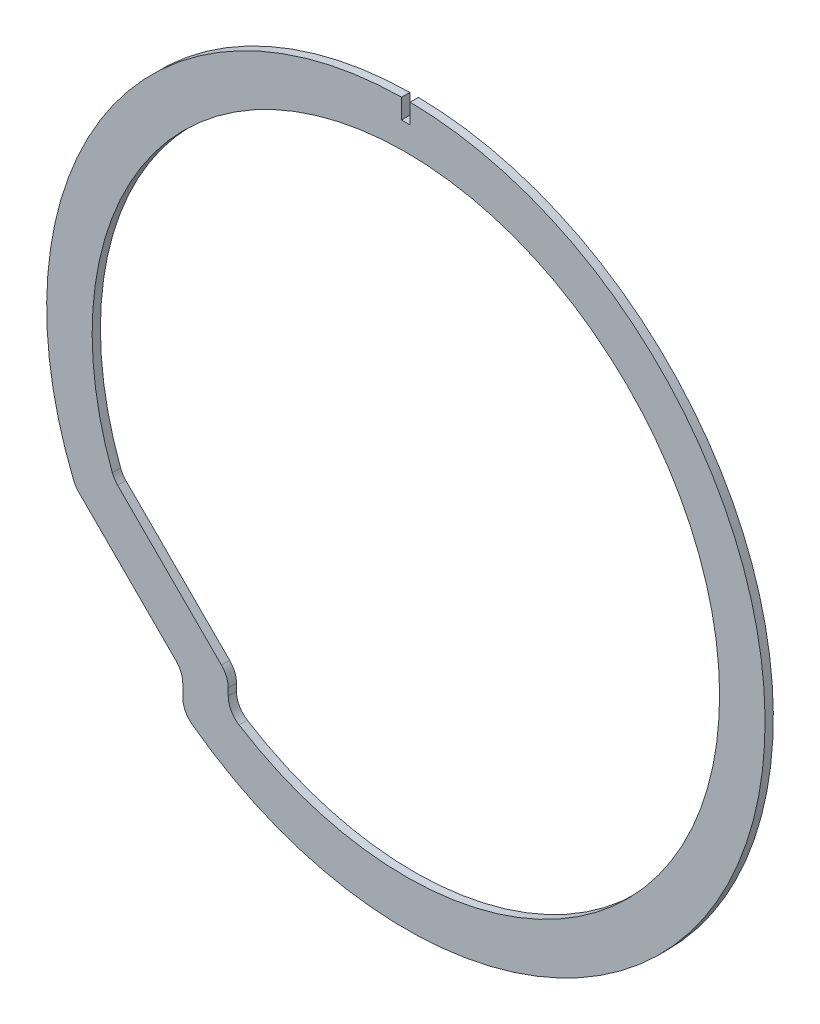
ISO-10303-21;
HEADER;
FILE_DESCRIPTION(('STEP AP214'),'2;1');
FILE_NAME('part.step','',(''),(''),'','','');
FILE_SCHEMA(('AUTOMOTIVE_DESIGN { 1 0 10303 214 1 1 1 1 }'));
ENDSEC;
DATA;
#1=APPLICATION_CONTEXT('core data for automotive mechanical design processes');
#2=APPLICATION_PROTOCOL_DEFINITION('international standard','automotive_design',2000,#1);
#3=PRODUCT_CONTEXT('',#1,'mechanical');
#4=PRODUCT('Part','Part','',(#3));
#5=PRODUCT_RELATED_PRODUCT_CATEGORY('part','',(#4));
#6=PRODUCT_DEFINITION_FORMATION('','',#4);
#7=PRODUCT_DEFINITION_CONTEXT('part definition',#1,'design');
#8=PRODUCT_DEFINITION('design','',#6,#7);
#9=PRODUCT_DEFINITION_SHAPE('','',#8);
#10=(LENGTH_UNIT() NAMED_UNIT(*) SI_UNIT(.MILLI.,.METRE.));
#11=(NAMED_UNIT(*) PLANE_ANGLE_UNIT() SI_UNIT($,.RADIAN.));
#12=(NAMED_UNIT(*) SI_UNIT($,.STERADIAN.) SOLID_ANGLE_UNIT());
#13=UNCERTAINTY_MEASURE_WITH_UNIT(LENGTH_MEASURE(1.E-05),#10,'distance_accuracy_value','');
#14=(GEOMETRIC_REPRESENTATION_CONTEXT(3) GLOBAL_UNCERTAINTY_ASSIGNED_CONTEXT((#13)) GLOBAL_UNIT_ASSIGNED_CONTEXT((#10,
#11,#12)) REPRESENTATION_CONTEXT('',''));
#15=CARTESIAN_POINT('',(0.,0.,0.));
#16=DIRECTION('',(0.,0.,1.));
#17=DIRECTION('',(1.,0.,0.));
#18=AXIS2_PLACEMENT_3D('',#15,#16,#17);
#19=CARTESIAN_POINT('',(0.,21.844,1.5875));
#20=DIRECTION('',(0.,0.,-1.));
#21=DIRECTION('',(-1.,0.,0.));
#22=AXIS2_PLACEMENT_3D('',#19,#20,#21);
#23=CYLINDRICAL_SURFACE('',#22,138.43);
#24=DIRECTION('',(0.,0.,1.));
#25=VECTOR('',#24,1.);
#26=CARTESIAN_POINT('',(-1.65404660342628,160.264117865264,-1.58750000000002));
#27=LINE('',#26,#25);
#28=CARTESIAN_POINT('',(-1.65404660342628,160.264117865264,-1.58750000000002));
#29=VERTEX_POINT('',#28);
#30=CARTESIAN_POINT('',(-1.65404660342628,160.264117865264,1.5875));
#31=VERTEX_POINT('',#30);
#32=EDGE_CURVE('E270',#29,#31,#27,.T.);
#33=ORIENTED_EDGE('',*,*,#32,.F.);
#34=CARTESIAN_POINT('',(0.,21.844,-1.5875));
#35=DIRECTION('',(0.,0.,1.));
#36=DIRECTION('',(1.,0.,0.));
#37=AXIS2_PLACEMENT_3D('',#34,#35,#36);
#38=CIRCLE('',#37,138.43);
#39=CARTESIAN_POINT('',(-127.991910594261,-30.8905780530259,-1.5875));
#40=VERTEX_POINT('',#39);
#41=EDGE_CURVE('E193',#29,#40,#38,.T.);
#42=ORIENTED_EDGE('',*,*,#41,.T.);
#43=DIRECTION('',(0.,0.,-1.));
#44=VECTOR('',#43,1.);
#45=CARTESIAN_POINT('',(-127.991910594261,-30.8905780530259,1.5875));
#46=LINE('',#45,#44);
#47=CARTESIAN_POINT('',(-127.991910594261,-30.8905780530259,1.5875));
#48=VERTEX_POINT('',#47);
#49=EDGE_CURVE('E218',#40,#48,#46,.F.);
#50=ORIENTED_EDGE('',*,*,#49,.T.);
#51=CARTESIAN_POINT('',(0.,21.844,1.5875));
#52=DIRECTION('',(0.,0.,1.));
#53=DIRECTION('',(1.,0.,0.));
#54=AXIS2_PLACEMENT_3D('',#51,#52,#53);
#55=CIRCLE('',#54,138.43);
#56=EDGE_CURVE('E197',#31,#48,#55,.T.);
#57=ORIENTED_EDGE('',*,*,#56,.F.);
#58=EDGE_LOOP('',(#33,#42,#50,#57));
#59=FACE_BOUND('',#58,.T.);
#60=ADVANCED_FACE('F37',(#59),#23,.T.);
#61=CARTESIAN_POINT('',(0.,21.844,1.5875));
#62=DIRECTION('',(0.,0.,1.));
#63=DIRECTION('',(1.,0.,0.));
#64=AXIS2_PLACEMENT_3D('',#61,#62,#63);
#65=PLANE('',#64);
#66=DIRECTION('',(0.,-1.,0.));
#67=VECTOR('',#66,1.);
#68=CARTESIAN_POINT('',(-68.4581307618716,-66.6049212990085,1.5875));
#69=LINE('',#68,#67);
#70=CARTESIAN_POINT('',(-68.4581307618716,-70.2872798685054,1.5875));
#71=VERTEX_POINT('',#70);
#72=CARTESIAN_POINT('',(-68.4581307618715,-73.0178679635636,1.5875));
#73=VERTEX_POINT('',#72);
#74=EDGE_CURVE('E266',#71,#73,#69,.T.);
#75=ORIENTED_EDGE('',*,*,#74,.F.);
#76=CARTESIAN_POINT('',(-77.3481307618716,-70.2872798685054,1.58750000000002));
#77=DIRECTION('',(0.,0.,1.));
#78=DIRECTION('',(1.,0.,0.));
#79=AXIS2_PLACEMENT_3D('',#76,#77,#78);
#80=CIRCLE('',#79,8.89);
#81=CARTESIAN_POINT('',(-71.0619514771232,-64.0011005837569,1.5875));
#82=VERTEX_POINT('',#81);
#83=EDGE_CURVE('E221',#71,#82,#80,.T.);
#84=ORIENTED_EDGE('',*,*,#83,.T.);
#85=DIRECTION('',(0.707106781186551,-0.707106781186544,0.));
#86=VECTOR('',#85,1.);
#87=CARTESIAN_POINT('',(-112.423113331304,-22.6399387295762,1.5875));
#88=LINE('',#87,#86);
#89=CARTESIAN_POINT('',(-111.094637556966,-23.9684145039149,1.5875));
#90=VERTEX_POINT('',#89);
#91=EDGE_CURVE('E262',#90,#82,#88,.T.);
#92=ORIENTED_EDGE('',*,*,#91,.F.);
#93=CARTESIAN_POINT('',(-104.808458272217,-17.6822352191664,1.58750000000002));
#94=DIRECTION('',(0.,0.,1.));
#95=DIRECTION('',(1.,0.,0.));
#96=AXIS2_PLACEMENT_3D('',#93,#94,#95);
#97=CIRCLE('',#96,8.89);
#98=CARTESIAN_POINT('',(-113.126589881123,-20.8192380143384,1.5875));
#99=VERTEX_POINT('',#98);
#100=EDGE_CURVE('E187',#90,#99,#97,.F.);
#101=ORIENTED_EDGE('',*,*,#100,.T.);
#102=CARTESIAN_POINT('',(0.,21.844,1.5875));
#103=DIRECTION('',(0.,0.,1.));
#104=DIRECTION('',(1.,0.,0.));
#105=AXIS2_PLACEMENT_3D('',#102,#103,#104);
#106=CIRCLE('',#105,120.904);
#107=CARTESIAN_POINT('',(-64.2957601874169,-80.5465876432115,1.5875));
#108=VERTEX_POINT('',#107);
#109=EDGE_CURVE('E243',#108,#99,#106,.T.);
#110=ORIENTED_EDGE('',*,*,#109,.F.);
#111=CARTESIAN_POINT('',(-59.5681307618716,-73.0178679635636,1.58750000000002));
#112=DIRECTION('',(0.,0.,1.));
#113=DIRECTION('',(1.,0.,0.));
#114=AXIS2_PLACEMENT_3D('',#111,#112,#113);
#115=CIRCLE('',#114,8.89);
#116=EDGE_CURVE('E47',#108,#73,#115,.F.);
#117=ORIENTED_EDGE('',*,*,#116,.T.);
#118=EDGE_LOOP('',(#75,#84,#92,#101,#110,#117));
#119=FACE_BOUND('',#118,.T.);
#120=DIRECTION('',(0.999999999678307,2.53650800309862E-05,0.));
#121=VECTOR('',#120,1.);
#122=CARTESIAN_POINT('',(-0.00387183132879656,152.644159719628,1.5875));
#123=LINE('',#122,#121);
#124=CARTESIAN_POINT('',(-1.65385332151647,152.644117867716,1.5875));
#125=VERTEX_POINT('',#124);
#126=CARTESIAN_POINT('',(1.64814667742129,152.64420162321,1.5875));
#127=VERTEX_POINT('',#126);
#128=EDGE_CURVE('E497',#125,#127,#123,.T.);
#129=ORIENTED_EDGE('',*,*,#128,.F.);
#130=DIRECTION('',(-2.53650800268556E-05,0.999999999678307,0.));
#131=VECTOR('',#130,1.);
#132=CARTESIAN_POINT('',(-1.64998149018831,-4.18519125549203E-05,1.5875));
#133=LINE('',#132,#131);
#134=EDGE_CURVE('E501',#125,#31,#133,.T.);
#135=ORIENTED_EDGE('',*,*,#134,.T.);
#136=ORIENTED_EDGE('',*,*,#56,.T.);
#137=CARTESIAN_POINT('',(-119.772246611143,-27.5039537743912,1.5875));
#138=DIRECTION('',(0.,0.,1.));
#139=DIRECTION('',(1.,0.,0.));
#140=AXIS2_PLACEMENT_3D('',#137,#138,#139);
#141=CIRCLE('',#140,8.89);
#142=CARTESIAN_POINT('',(-126.058425895892,-33.7901330591397,1.5875));
#143=VERTEX_POINT('',#142);
#144=EDGE_CURVE('E225',#48,#143,#141,.T.);
#145=ORIENTED_EDGE('',*,*,#144,.T.);
#146=DIRECTION('',(0.707106781186551,-0.707106781186544,0.));
#147=VECTOR('',#146,1.);
#148=CARTESIAN_POINT('',(-127.29330891879,-32.5552500362416,1.5875));
#149=LINE('',#148,#147);
#150=CARTESIAN_POINT('',(-88.5879514771231,-71.2606074779079,1.5875));
#151=VERTEX_POINT('',#150);
#152=EDGE_CURVE('E160',#143,#151,#149,.T.);
#153=ORIENTED_EDGE('',*,*,#152,.T.);
#154=CARTESIAN_POINT('',(-94.8741307618715,-77.5467867626563,1.5875));
#155=DIRECTION('',(0.,0.,1.));
#156=DIRECTION('',(1.,0.,0.));
#157=AXIS2_PLACEMENT_3D('',#154,#155,#156);
#158=CIRCLE('',#157,8.89);
#159=CARTESIAN_POINT('',(-85.9841307618715,-77.5467867626563,1.5875));
#160=VERTEX_POINT('',#159);
#161=EDGE_CURVE('E153',#151,#160,#158,.F.);
#162=ORIENTED_EDGE('',*,*,#161,.T.);
#163=DIRECTION('',(0.,-1.,0.));
#164=VECTOR('',#163,1.);
#165=CARTESIAN_POINT('',(-85.9841307618715,-73.8644281931595,1.5875));
#166=LINE('',#165,#164);
#167=CARTESIAN_POINT('',(-85.9841307618715,-82.2574245919404,1.5875));
#168=VERTEX_POINT('',#167);
#169=EDGE_CURVE('E157',#160,#168,#166,.T.);
#170=ORIENTED_EDGE('',*,*,#169,.T.);
#171=CARTESIAN_POINT('',(-77.0941307618715,-82.2574245919404,1.5875));
#172=DIRECTION('',(0.,0.,1.));
#173=DIRECTION('',(1.,0.,0.));
#174=AXIS2_PLACEMENT_3D('',#171,#172,#173);
#175=CIRCLE('',#174,8.89);
#176=CARTESIAN_POINT('',(-82.3849044416078,-89.4016400051128,1.5875));
#177=VERTEX_POINT('',#176);
#178=EDGE_CURVE('E223',#168,#177,#175,.T.);
#179=ORIENTED_EDGE('',*,*,#178,.T.);
#180=CARTESIAN_POINT('',(1.64795339579251,160.264190541717,1.5875));
#181=VERTEX_POINT('',#180);
#182=EDGE_CURVE('E274',#177,#181,#55,.T.);
#183=ORIENTED_EDGE('',*,*,#182,.T.);
#184=DIRECTION('',(-2.53650800271401E-05,0.999999999678307,0.));
#185=VECTOR('',#184,1.);
#186=CARTESIAN_POINT('',(1.6520185087495,4.1903581694228E-05,1.5875));
#187=LINE('',#186,#185);
#188=EDGE_CURVE('E500',#127,#181,#187,.T.);
#189=ORIENTED_EDGE('',*,*,#188,.F.);
#190=EDGE_LOOP('',(#129,#135,#136,#145,#153,#162,#170,#179,#183,#189));
#191=FACE_BOUND('',#190,.T.);
#192=ADVANCED_FACE('F156',(#119,#191),#65,.T.);
#193=CARTESIAN_POINT('',(0.,21.844,-1.5875));
#194=DIRECTION('',(0.,0.,1.));
#195=DIRECTION('',(1.,0.,0.));
#196=AXIS2_PLACEMENT_3D('',#193,#194,#195);
#197=PLANE('',#196);
#198=DIRECTION('',(-0.707106781186551,0.707106781186544,0.));
#199=VECTOR('',#198,1.);
#200=CARTESIAN_POINT('',(-112.423113331304,-22.6399387295762,-1.58750000000002));
#201=LINE('',#200,#199);
#202=CARTESIAN_POINT('',(-71.0619514771232,-64.0011005837569,-1.58750000000002));
#203=VERTEX_POINT('',#202);
#204=CARTESIAN_POINT('',(-111.094637556966,-23.9684145039149,-1.58750000000002));
#205=VERTEX_POINT('',#204);
#206=EDGE_CURVE('E253',#203,#205,#201,.T.);
#207=ORIENTED_EDGE('',*,*,#206,.F.);
#208=CARTESIAN_POINT('',(-77.3481307618716,-70.2872798685054,-1.58750000000002));
#209=DIRECTION('',(0.,0.,1.));
#210=DIRECTION('',(1.,0.,0.));
#211=AXIS2_PLACEMENT_3D('',#208,#209,#210);
#212=CIRCLE('',#211,8.89);
#213=CARTESIAN_POINT('',(-68.4581307618716,-70.2872798685054,-1.58750000000002));
#214=VERTEX_POINT('',#213);
#215=EDGE_CURVE('E208',#203,#214,#212,.F.);
#216=ORIENTED_EDGE('',*,*,#215,.T.);
#217=DIRECTION('',(0.,1.,0.));
#218=VECTOR('',#217,1.);
#219=CARTESIAN_POINT('',(-68.4581307618716,-66.6049212990085,-1.58750000000002));
#220=LINE('',#219,#218);
#221=CARTESIAN_POINT('',(-68.4581307618715,-73.0178679635636,-1.58750000000002));
#222=VERTEX_POINT('',#221);
#223=EDGE_CURVE('E254',#222,#214,#220,.T.);
#224=ORIENTED_EDGE('',*,*,#223,.F.);
#225=CARTESIAN_POINT('',(-59.5681307618716,-73.0178679635636,-1.58750000000002));
#226=DIRECTION('',(0.,0.,1.));
#227=DIRECTION('',(1.,0.,0.));
#228=AXIS2_PLACEMENT_3D('',#225,#226,#227);
#229=CIRCLE('',#228,8.89);
#230=CARTESIAN_POINT('',(-64.2957601874169,-80.5465876432115,-1.58750000000002));
#231=VERTEX_POINT('',#230);
#232=EDGE_CURVE('E11',#222,#231,#229,.T.);
#233=ORIENTED_EDGE('',*,*,#232,.T.);
#234=CARTESIAN_POINT('',(0.,21.844,-1.58750000000002));
#235=DIRECTION('',(0.,0.,1.));
#236=DIRECTION('',(1.,0.,0.));
#237=AXIS2_PLACEMENT_3D('',#234,#235,#236);
#238=CIRCLE('',#237,120.904);
#239=CARTESIAN_POINT('',(-113.126589881123,-20.8192380143384,-1.58750000000002));
#240=VERTEX_POINT('',#239);
#241=EDGE_CURVE('E240',#240,#231,#238,.F.);
#242=ORIENTED_EDGE('',*,*,#241,.F.);
#243=CARTESIAN_POINT('',(-104.808458272217,-17.6822352191664,-1.58750000000002));
#244=DIRECTION('',(0.,0.,1.));
#245=DIRECTION('',(1.,0.,0.));
#246=AXIS2_PLACEMENT_3D('',#243,#244,#245);
#247=CIRCLE('',#246,8.89);
#248=EDGE_CURVE('E189',#240,#205,#247,.T.);
#249=ORIENTED_EDGE('',*,*,#248,.T.);
#250=EDGE_LOOP('',(#207,#216,#224,#233,#242,#249));
#251=FACE_BOUND('',#250,.T.);
#252=DIRECTION('',(-2.53650800268556E-05,0.999999999678307,0.));
#253=VECTOR('',#252,1.);
#254=CARTESIAN_POINT('',(-1.64998149018831,-4.18519125549203E-05,-1.58750000000002));
#255=LINE('',#254,#253);
#256=CARTESIAN_POINT('',(-1.65385332151647,152.644117867716,-1.58750000000002));
#257=VERTEX_POINT('',#256);
#258=EDGE_CURVE('E503',#257,#29,#255,.T.);
#259=ORIENTED_EDGE('',*,*,#258,.F.);
#260=DIRECTION('',(0.999999999678307,2.53650800309862E-05,0.));
#261=VECTOR('',#260,1.);
#262=CARTESIAN_POINT('',(-0.00387183132879656,152.644159719628,-1.58750000000002));
#263=LINE('',#262,#261);
#264=CARTESIAN_POINT('',(1.64814667742129,152.64420162321,-1.5875));
#265=VERTEX_POINT('',#264);
#266=EDGE_CURVE('E504',#257,#265,#263,.T.);
#267=ORIENTED_EDGE('',*,*,#266,.T.);
#268=DIRECTION('',(-2.53650800271401E-05,0.999999999678307,0.));
#269=VECTOR('',#268,1.);
#270=CARTESIAN_POINT('',(1.6520185087495,4.1903581694228E-05,-1.58750000000002));
#271=LINE('',#270,#269);
#272=CARTESIAN_POINT('',(1.64795339579251,160.264190541717,-1.58750000000001));
#273=VERTEX_POINT('',#272);
#274=EDGE_CURVE('E56',#265,#273,#271,.T.);
#275=ORIENTED_EDGE('',*,*,#274,.T.);
#276=CARTESIAN_POINT('',(-82.3849044416078,-89.4016400051128,-1.5875));
#277=VERTEX_POINT('',#276);
#278=EDGE_CURVE('E195',#277,#273,#38,.T.);
#279=ORIENTED_EDGE('',*,*,#278,.F.);
#280=CARTESIAN_POINT('',(-77.0941307618715,-82.2574245919404,-1.5875));
#281=DIRECTION('',(0.,0.,1.));
#282=DIRECTION('',(1.,0.,0.));
#283=AXIS2_PLACEMENT_3D('',#280,#281,#282);
#284=CIRCLE('',#283,8.89);
#285=CARTESIAN_POINT('',(-85.9841307618715,-82.2574245919404,-1.5875));
#286=VERTEX_POINT('',#285);
#287=EDGE_CURVE('E210',#277,#286,#284,.F.);
#288=ORIENTED_EDGE('',*,*,#287,.T.);
#289=DIRECTION('',(0.,-1.,0.));
#290=VECTOR('',#289,1.);
#291=CARTESIAN_POINT('',(-85.9841307618715,-73.8644281931595,-1.5875));
#292=LINE('',#291,#290);
#293=CARTESIAN_POINT('',(-85.9841307618715,-77.5467867626563,-1.5875));
#294=VERTEX_POINT('',#293);
#295=EDGE_CURVE('E196',#294,#286,#292,.T.);
#296=ORIENTED_EDGE('',*,*,#295,.F.);
#297=CARTESIAN_POINT('',(-94.8741307618715,-77.5467867626563,-1.5875));
#298=DIRECTION('',(0.,0.,1.));
#299=DIRECTION('',(1.,0.,0.));
#300=AXIS2_PLACEMENT_3D('',#297,#298,#299);
#301=CIRCLE('',#300,8.89);
#302=CARTESIAN_POINT('',(-88.5879514771231,-71.2606074779079,-1.5875));
#303=VERTEX_POINT('',#302);
#304=EDGE_CURVE('E164',#294,#303,#301,.T.);
#305=ORIENTED_EDGE('',*,*,#304,.T.);
#306=DIRECTION('',(0.707106781186551,-0.707106781186544,0.));
#307=VECTOR('',#306,1.);
#308=CARTESIAN_POINT('',(-127.29330891879,-32.5552500362416,-1.5875));
#309=LINE('',#308,#307);
#310=CARTESIAN_POINT('',(-126.058425895892,-33.7901330591397,-1.5875));
#311=VERTEX_POINT('',#310);
#312=EDGE_CURVE('E273',#311,#303,#309,.T.);
#313=ORIENTED_EDGE('',*,*,#312,.F.);
#314=CARTESIAN_POINT('',(-119.772246611143,-27.5039537743912,-1.5875));
#315=DIRECTION('',(0.,0.,1.));
#316=DIRECTION('',(1.,0.,0.));
#317=AXIS2_PLACEMENT_3D('',#314,#315,#316);
#318=CIRCLE('',#317,8.89);
#319=EDGE_CURVE('E212',#311,#40,#318,.F.);
#320=ORIENTED_EDGE('',*,*,#319,.T.);
#321=ORIENTED_EDGE('',*,*,#41,.F.);
#322=EDGE_LOOP('',(#259,#267,#275,#279,#288,#296,#305,#313,#320,#321));
#323=FACE_BOUND('',#322,.T.);
#324=ADVANCED_FACE('F248',(#251,#323),#197,.F.);
#325=CARTESIAN_POINT('',(-127.29330891879,-32.5552500362416,1.5875));
#326=DIRECTION('',(0.707106781186544,0.707106781186551,0.));
#327=DIRECTION('',(-0.707106781186551,0.707106781186544,0.));
#328=AXIS2_PLACEMENT_3D('',#325,#326,#327);
#329=PLANE('',#328);
#330=ORIENTED_EDGE('',*,*,#152,.F.);
#331=DIRECTION('',(0.,0.,-1.));
#332=VECTOR('',#331,1.);
#333=CARTESIAN_POINT('',(-126.058425895892,-33.7901330591397,1.5875));
#334=LINE('',#333,#332);
#335=EDGE_CURVE('E205',#143,#311,#334,.T.);
#336=ORIENTED_EDGE('',*,*,#335,.T.);
#337=ORIENTED_EDGE('',*,*,#312,.T.);
#338=DIRECTION('',(0.,0.,-1.));
#339=VECTOR('',#338,1.);
#340=CARTESIAN_POINT('',(-88.5879514771232,-71.2606074779079,1.5875));
#341=LINE('',#340,#339);
#342=EDGE_CURVE('E174',#303,#151,#341,.F.);
#343=ORIENTED_EDGE('',*,*,#342,.T.);
#344=EDGE_LOOP('',(#330,#336,#337,#343));
#345=FACE_BOUND('',#344,.T.);
#346=ADVANCED_FACE('F328',(#345),#329,.F.);
#347=CARTESIAN_POINT('',(-85.9841307618715,-73.8644281931595,1.5875));
#348=DIRECTION('',(1.,0.,0.));
#349=DIRECTION('',(0.,1.,0.));
#350=AXIS2_PLACEMENT_3D('',#347,#348,#349);
#351=PLANE('',#350);
#352=ORIENTED_EDGE('',*,*,#169,.F.);
#353=DIRECTION('',(0.,0.,-1.));
#354=VECTOR('',#353,1.);
#355=CARTESIAN_POINT('',(-85.9841307618715,-77.5467867626563,-1.5875));
#356=LINE('',#355,#354);
#357=EDGE_CURVE('E170',#160,#294,#356,.T.);
#358=ORIENTED_EDGE('',*,*,#357,.T.);
#359=ORIENTED_EDGE('',*,*,#295,.T.);
#360=DIRECTION('',(0.,0.,-1.));
#361=VECTOR('',#360,1.);
#362=CARTESIAN_POINT('',(-85.9841307618715,-82.2574245919404,1.5875));
#363=LINE('',#362,#361);
#364=EDGE_CURVE('E173',#286,#168,#363,.F.);
#365=ORIENTED_EDGE('',*,*,#364,.T.);
#366=EDGE_LOOP('',(#352,#358,#359,#365));
#367=FACE_BOUND('',#366,.T.);
#368=ADVANCED_FACE('F168',(#367),#351,.F.);
#369=ORIENTED_EDGE('',*,*,#278,.T.);
#370=DIRECTION('',(0.,0.,-1.));
#371=VECTOR('',#370,1.);
#372=CARTESIAN_POINT('',(1.64795339579251,160.264190541717,1.5875));
#373=LINE('',#372,#371);
#374=EDGE_CURVE('E41',#273,#181,#373,.F.);
#375=ORIENTED_EDGE('',*,*,#374,.T.);
#376=ORIENTED_EDGE('',*,*,#182,.F.);
#377=DIRECTION('',(0.,0.,-1.));
#378=VECTOR('',#377,1.);
#379=CARTESIAN_POINT('',(-82.3849044416078,-89.4016400051128,1.5875));
#380=LINE('',#379,#378);
#381=EDGE_CURVE('E215',#177,#277,#380,.T.);
#382=ORIENTED_EDGE('',*,*,#381,.T.);
#383=EDGE_LOOP('',(#369,#375,#376,#382));
#384=FACE_BOUND('',#383,.T.);
#385=ADVANCED_FACE('F287',(#384),#23,.T.);
#386=CARTESIAN_POINT('',(0.,21.844,-343.555653090313));
#387=DIRECTION('',(0.,0.,1.));
#388=DIRECTION('',(1.,0.,0.));
#389=AXIS2_PLACEMENT_3D('',#386,#387,#388);
#390=CYLINDRICAL_SURFACE('',#389,120.904);
#391=ORIENTED_EDGE('',*,*,#109,.T.);
#392=DIRECTION('',(0.,0.,1.));
#393=VECTOR('',#392,1.);
#394=CARTESIAN_POINT('',(-113.126589881123,-20.8192380143384,-343.555653090313));
#395=LINE('',#394,#393);
#396=EDGE_CURVE('E181',#99,#240,#395,.F.);
#397=ORIENTED_EDGE('',*,*,#396,.T.);
#398=ORIENTED_EDGE('',*,*,#241,.T.);
#399=DIRECTION('',(0.,0.,1.));
#400=VECTOR('',#399,1.);
#401=CARTESIAN_POINT('',(-64.2957601874169,-80.5465876432115,-343.555653090313));
#402=LINE('',#401,#400);
#403=EDGE_CURVE('E232',#231,#108,#402,.T.);
#404=ORIENTED_EDGE('',*,*,#403,.T.);
#405=EDGE_LOOP('',(#391,#397,#398,#404));
#406=FACE_BOUND('',#405,.T.);
#407=ADVANCED_FACE('F239',(#406),#390,.F.);
#408=CARTESIAN_POINT('',(-68.4581307618716,-66.6049212990085,-343.555653090313));
#409=DIRECTION('',(-1.,0.,0.));
#410=DIRECTION('',(0.,-1.,0.));
#411=AXIS2_PLACEMENT_3D('',#408,#409,#410);
#412=PLANE('',#411);
#413=ORIENTED_EDGE('',*,*,#223,.T.);
#414=DIRECTION('',(0.,0.,1.));
#415=VECTOR('',#414,1.);
#416=CARTESIAN_POINT('',(-68.4581307618716,-70.2872798685054,-343.555653090313));
#417=LINE('',#416,#415);
#418=EDGE_CURVE('E179',#214,#71,#417,.T.);
#419=ORIENTED_EDGE('',*,*,#418,.T.);
#420=ORIENTED_EDGE('',*,*,#74,.T.);
#421=DIRECTION('',(0.,0.,-1.));
#422=VECTOR('',#421,1.);
#423=CARTESIAN_POINT('',(-68.4581307618715,-73.0178679635636,-1.58750000000002));
#424=LINE('',#423,#422);
#425=EDGE_CURVE('E177',#73,#222,#424,.T.);
#426=ORIENTED_EDGE('',*,*,#425,.T.);
#427=EDGE_LOOP('',(#413,#419,#420,#426));
#428=FACE_BOUND('',#427,.T.);
#429=ADVANCED_FACE('F299',(#428),#412,.F.);
#430=CARTESIAN_POINT('',(-112.423113331304,-22.6399387295762,-343.555653090313));
#431=DIRECTION('',(-0.707106781186544,-0.707106781186551,0.));
#432=DIRECTION('',(0.707106781186551,-0.707106781186544,0.));
#433=AXIS2_PLACEMENT_3D('',#430,#431,#432);
#434=PLANE('',#433);
#435=ORIENTED_EDGE('',*,*,#206,.T.);
#436=DIRECTION('',(0.,0.,-1.));
#437=VECTOR('',#436,1.);
#438=CARTESIAN_POINT('',(-111.094637556966,-23.9684145039149,1.58750000000002));
#439=LINE('',#438,#437);
#440=EDGE_CURVE('E229',#205,#90,#439,.F.);
#441=ORIENTED_EDGE('',*,*,#440,.T.);
#442=ORIENTED_EDGE('',*,*,#91,.T.);
#443=DIRECTION('',(0.,0.,1.));
#444=VECTOR('',#443,1.);
#445=CARTESIAN_POINT('',(-71.0619514771232,-64.0011005837569,-343.555653090313));
#446=LINE('',#445,#444);
#447=EDGE_CURVE('E227',#82,#203,#446,.F.);
#448=ORIENTED_EDGE('',*,*,#447,.T.);
#449=EDGE_LOOP('',(#435,#441,#442,#448));
#450=FACE_BOUND('',#449,.T.);
#451=ADVANCED_FACE('F261',(#450),#434,.F.);
#452=CARTESIAN_POINT('',(-119.772246611143,-27.5039537743912,1.5875));
#453=DIRECTION('',(0.,0.,-1.));
#454=DIRECTION('',(-1.,0.,0.));
#455=AXIS2_PLACEMENT_3D('',#452,#453,#454);
#456=CYLINDRICAL_SURFACE('',#455,8.89);
#457=ORIENTED_EDGE('',*,*,#144,.F.);
#458=ORIENTED_EDGE('',*,*,#49,.F.);
#459=ORIENTED_EDGE('',*,*,#319,.F.);
#460=ORIENTED_EDGE('',*,*,#335,.F.);
#461=EDGE_LOOP('',(#457,#458,#459,#460));
#462=FACE_BOUND('',#461,.T.);
#463=ADVANCED_FACE('F334',(#462),#456,.T.);
#464=CARTESIAN_POINT('',(-104.808458272217,-17.6822352191664,-343.555653090313));
#465=DIRECTION('',(0.,0.,1.));
#466=DIRECTION('',(1.,0.,0.));
#467=AXIS2_PLACEMENT_3D('',#464,#465,#466);
#468=CYLINDRICAL_SURFACE('',#467,8.89);
#469=ORIENTED_EDGE('',*,*,#248,.F.);
#470=ORIENTED_EDGE('',*,*,#396,.F.);
#471=ORIENTED_EDGE('',*,*,#100,.F.);
#472=ORIENTED_EDGE('',*,*,#440,.F.);
#473=EDGE_LOOP('',(#469,#470,#471,#472));
#474=FACE_BOUND('',#473,.T.);
#475=ADVANCED_FACE('F257',(#474),#468,.F.);
#476=CARTESIAN_POINT('',(-94.8741307618715,-77.5467867626563,1.5875));
#477=DIRECTION('',(0.,0.,1.));
#478=DIRECTION('',(1.,0.,0.));
#479=AXIS2_PLACEMENT_3D('',#476,#477,#478);
#480=CYLINDRICAL_SURFACE('',#479,8.89);
#481=ORIENTED_EDGE('',*,*,#161,.F.);
#482=ORIENTED_EDGE('',*,*,#342,.F.);
#483=ORIENTED_EDGE('',*,*,#304,.F.);
#484=ORIENTED_EDGE('',*,*,#357,.F.);
#485=EDGE_LOOP('',(#481,#482,#483,#484));
#486=FACE_BOUND('',#485,.T.);
#487=ADVANCED_FACE('F176',(#486),#480,.F.);
#488=CARTESIAN_POINT('',(-77.0941307618715,-82.2574245919404,1.5875));
#489=DIRECTION('',(0.,0.,-1.));
#490=DIRECTION('',(-1.,0.,0.));
#491=AXIS2_PLACEMENT_3D('',#488,#489,#490);
#492=CYLINDRICAL_SURFACE('',#491,8.89);
#493=ORIENTED_EDGE('',*,*,#178,.F.);
#494=ORIENTED_EDGE('',*,*,#364,.F.);
#495=ORIENTED_EDGE('',*,*,#287,.F.);
#496=ORIENTED_EDGE('',*,*,#381,.F.);
#497=EDGE_LOOP('',(#493,#494,#495,#496));
#498=FACE_BOUND('',#497,.T.);
#499=ADVANCED_FACE('F282',(#498),#492,.T.);
#500=CARTESIAN_POINT('',(-77.3481307618716,-70.2872798685054,-343.555653090313));
#501=DIRECTION('',(0.,0.,1.));
#502=DIRECTION('',(1.,0.,0.));
#503=AXIS2_PLACEMENT_3D('',#500,#501,#502);
#504=CYLINDRICAL_SURFACE('',#503,8.89);
#505=ORIENTED_EDGE('',*,*,#215,.F.);
#506=ORIENTED_EDGE('',*,*,#447,.F.);
#507=ORIENTED_EDGE('',*,*,#83,.F.);
#508=ORIENTED_EDGE('',*,*,#418,.F.);
#509=EDGE_LOOP('',(#505,#506,#507,#508));
#510=FACE_BOUND('',#509,.T.);
#511=ADVANCED_FACE('F303',(#510),#504,.T.);
#512=CARTESIAN_POINT('',(-59.5681307618716,-73.0178679635636,-343.555653090313));
#513=DIRECTION('',(0.,0.,1.));
#514=DIRECTION('',(1.,0.,0.));
#515=AXIS2_PLACEMENT_3D('',#512,#513,#514);
#516=CYLINDRICAL_SURFACE('',#515,8.89);
#517=ORIENTED_EDGE('',*,*,#232,.F.);
#518=ORIENTED_EDGE('',*,*,#425,.F.);
#519=ORIENTED_EDGE('',*,*,#116,.F.);
#520=ORIENTED_EDGE('',*,*,#403,.F.);
#521=EDGE_LOOP('',(#517,#518,#519,#520));
#522=FACE_BOUND('',#521,.T.);
#523=ADVANCED_FACE('F39',(#522),#516,.F.);
#524=CARTESIAN_POINT('',(-1.64998149018831,-4.18519125549203E-05,-1.58750000000002));
#525=DIRECTION('',(0.999999999678306,2.53650800268556E-05,0.));
#526=DIRECTION('',(-2.53650800268556E-05,0.999999999678306,0.));
#527=AXIS2_PLACEMENT_3D('',#524,#525,#526);
#528=PLANE('',#527);
#529=ORIENTED_EDGE('',*,*,#134,.F.);
#530=DIRECTION('',(0.,0.,1.));
#531=VECTOR('',#530,1.);
#532=CARTESIAN_POINT('',(-1.65385332151647,152.644117867716,-1.58750000000002));
#533=LINE('',#532,#531);
#534=EDGE_CURVE('E76',#257,#125,#533,.T.);
#535=ORIENTED_EDGE('',*,*,#534,.F.);
#536=ORIENTED_EDGE('',*,*,#258,.T.);
#537=ORIENTED_EDGE('',*,*,#32,.T.);
#538=EDGE_LOOP('',(#529,#535,#536,#537));
#539=FACE_BOUND('',#538,.T.);
#540=ADVANCED_FACE('F309',(#539),#528,.T.);
#541=CARTESIAN_POINT('',(1.6520185087495,4.1903581694228E-05,-1.58750000000002));
#542=DIRECTION('',(0.999999999678306,2.53650800271401E-05,0.));
#543=DIRECTION('',(-2.53650800271401E-05,0.999999999678306,0.));
#544=AXIS2_PLACEMENT_3D('',#541,#542,#543);
#545=PLANE('',#544);
#546=ORIENTED_EDGE('',*,*,#188,.T.);
#547=ORIENTED_EDGE('',*,*,#374,.F.);
#548=ORIENTED_EDGE('',*,*,#274,.F.);
#549=DIRECTION('',(0.,0.,1.));
#550=VECTOR('',#549,1.);
#551=CARTESIAN_POINT('',(1.64814667742129,152.64420162321,-1.58750000000002));
#552=LINE('',#551,#550);
#553=EDGE_CURVE('E289',#265,#127,#552,.T.);
#554=ORIENTED_EDGE('',*,*,#553,.T.);
#555=EDGE_LOOP('',(#546,#547,#548,#554));
#556=FACE_BOUND('',#555,.T.);
#557=ADVANCED_FACE('F396',(#556),#545,.F.);
#558=CARTESIAN_POINT('',(-0.00387183132879656,152.644159719628,-1.58750000000002));
#559=DIRECTION('',(2.53650800309862E-05,-0.999999999678306,0.));
#560=DIRECTION('',(0.999999999678306,2.53650800309862E-05,0.));
#561=AXIS2_PLACEMENT_3D('',#558,#559,#560);
#562=PLANE('',#561);
#563=ORIENTED_EDGE('',*,*,#128,.T.);
#564=ORIENTED_EDGE('',*,*,#553,.F.);
#565=ORIENTED_EDGE('',*,*,#266,.F.);
#566=ORIENTED_EDGE('',*,*,#534,.T.);
#567=EDGE_LOOP('',(#563,#564,#565,#566));
#568=FACE_BOUND('',#567,.T.);
#569=ADVANCED_FACE('F406',(#568),#562,.F.);
#570=CLOSED_SHELL('',(#60,#192,#324,#346,#368,#385,#407,#429,#451,#463,#475,#487,#499,#511,#523,
#540,#557,#569));
#571=MANIFOLD_SOLID_BREP('B2',#570);
#572=ADVANCED_BREP_SHAPE_REPRESENTATION('',(#18,#571),#14);
#573=SHAPE_DEFINITION_REPRESENTATION(#9,#572);
ENDSEC;
END-ISO-10303-21;
